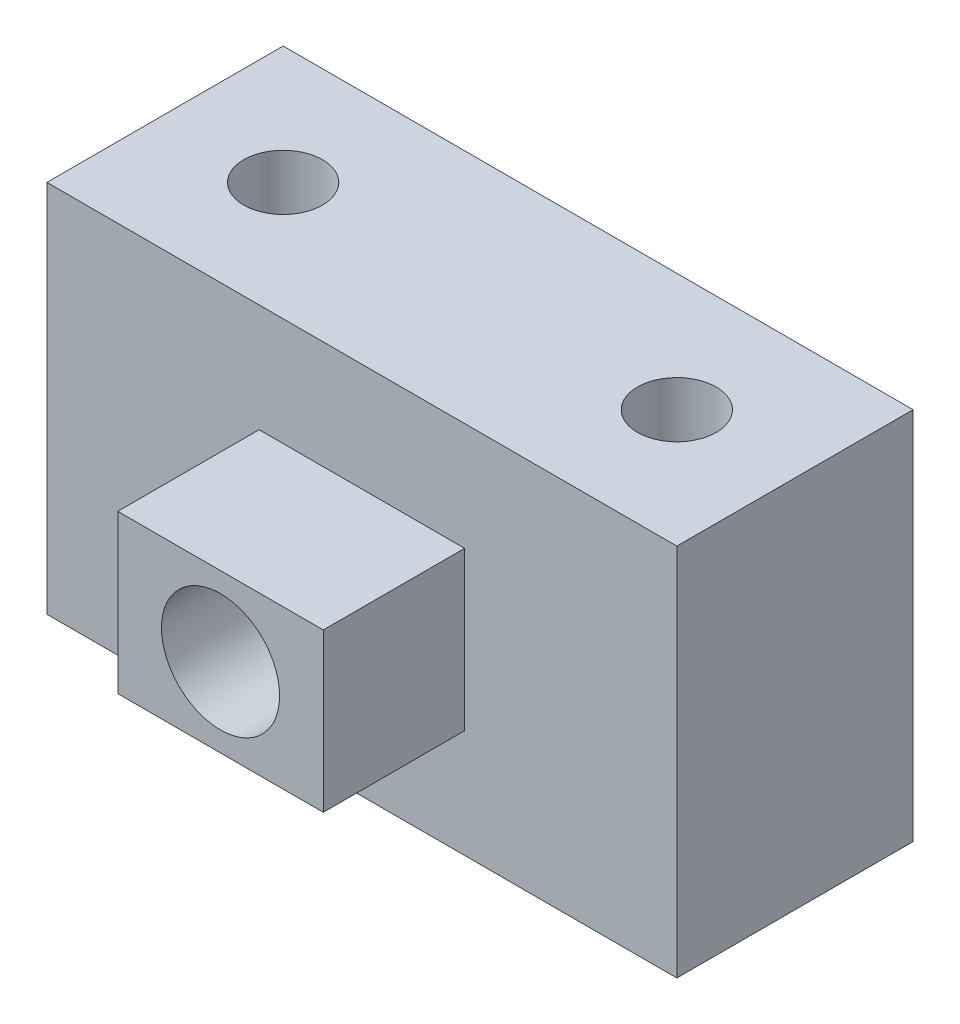
ISO-10303-21;
HEADER;
FILE_DESCRIPTION(('STEP AP214'),'2;1');
FILE_NAME('part.step','',(''),(''),'','','');
FILE_SCHEMA(('AUTOMOTIVE_DESIGN { 1 0 10303 214 1 1 1 1 }'));
ENDSEC;
DATA;
#1=APPLICATION_CONTEXT('core data for automotive mechanical design processes');
#2=APPLICATION_PROTOCOL_DEFINITION('international standard','automotive_design',2000,#1);
#3=PRODUCT_CONTEXT('',#1,'mechanical');
#4=PRODUCT('Part','Part','',(#3));
#5=PRODUCT_RELATED_PRODUCT_CATEGORY('part','',(#4));
#6=PRODUCT_DEFINITION_FORMATION('','',#4);
#7=PRODUCT_DEFINITION_CONTEXT('part definition',#1,'design');
#8=PRODUCT_DEFINITION('design','',#6,#7);
#9=PRODUCT_DEFINITION_SHAPE('','',#8);
#10=(LENGTH_UNIT() NAMED_UNIT(*) SI_UNIT(.MILLI.,.METRE.));
#11=(NAMED_UNIT(*) PLANE_ANGLE_UNIT() SI_UNIT($,.RADIAN.));
#12=(NAMED_UNIT(*) SI_UNIT($,.STERADIAN.) SOLID_ANGLE_UNIT());
#13=UNCERTAINTY_MEASURE_WITH_UNIT(LENGTH_MEASURE(1.E-05),#10,'distance_accuracy_value','');
#14=(GEOMETRIC_REPRESENTATION_CONTEXT(3) GLOBAL_UNCERTAINTY_ASSIGNED_CONTEXT((#13)) GLOBAL_UNIT_ASSIGNED_CONTEXT((#10,
#11,#12)) REPRESENTATION_CONTEXT('',''));
#15=CARTESIAN_POINT('',(0.,0.,0.));
#16=DIRECTION('',(0.,0.,1.));
#17=DIRECTION('',(1.,0.,0.));
#18=AXIS2_PLACEMENT_3D('',#15,#16,#17);
#19=CARTESIAN_POINT('',(-26.,0.,-12.));
#20=DIRECTION('',(0.,-1.,0.));
#21=DIRECTION('',(1.,0.,0.));
#22=AXIS2_PLACEMENT_3D('',#19,#20,#21);
#23=PLANE('',#22);
#24=CARTESIAN_POINT('',(0.,0.,-6.00000000000001));
#25=DIRECTION('',(0.,1.,0.));
#26=DIRECTION('',(0.,0.,1.));
#27=AXIS2_PLACEMENT_3D('',#24,#25,#26);
#28=CIRCLE('',#27,2.);
#29=CARTESIAN_POINT('',(0.,0.,-4.00000000000001));
#30=VERTEX_POINT('',#29);
#31=EDGE_CURVE('E141',#30,#30,#28,.T.);
#32=ORIENTED_EDGE('',*,*,#31,.T.);
#33=EDGE_LOOP('',(#32));
#34=FACE_BOUND('',#33,.T.);
#35=CARTESIAN_POINT('',(-20.,0.,-6.));
#36=DIRECTION('',(0.,1.,0.));
#37=DIRECTION('',(0.,0.,1.));
#38=AXIS2_PLACEMENT_3D('',#35,#36,#37);
#39=CIRCLE('',#38,2.);
#40=CARTESIAN_POINT('',(-20.,0.,-3.99999999999999));
#41=VERTEX_POINT('',#40);
#42=EDGE_CURVE('E136',#41,#41,#39,.T.);
#43=ORIENTED_EDGE('',*,*,#42,.T.);
#44=EDGE_LOOP('',(#43));
#45=FACE_BOUND('',#44,.T.);
#46=DIRECTION('',(1.,0.,0.));
#47=VECTOR('',#46,1.);
#48=CARTESIAN_POINT('',(-26.,0.,0.));
#49=LINE('',#48,#47);
#50=CARTESIAN_POINT('',(-26.,0.,0.));
#51=VERTEX_POINT('',#50);
#52=CARTESIAN_POINT('',(6.,0.,0.));
#53=VERTEX_POINT('',#52);
#54=EDGE_CURVE('E152',#51,#53,#49,.T.);
#55=ORIENTED_EDGE('',*,*,#54,.F.);
#56=DIRECTION('',(0.,0.,1.));
#57=VECTOR('',#56,1.);
#58=CARTESIAN_POINT('',(-26.,0.,-12.));
#59=LINE('',#58,#57);
#60=CARTESIAN_POINT('',(-26.,0.,-12.));
#61=VERTEX_POINT('',#60);
#62=EDGE_CURVE('E11',#61,#51,#59,.T.);
#63=ORIENTED_EDGE('',*,*,#62,.F.);
#64=DIRECTION('',(1.,0.,0.));
#65=VECTOR('',#64,1.);
#66=CARTESIAN_POINT('',(-6.,0.,-12.));
#67=LINE('',#66,#65);
#68=CARTESIAN_POINT('',(6.,0.,-12.));
#69=VERTEX_POINT('',#68);
#70=EDGE_CURVE('E59',#61,#69,#67,.T.);
#71=ORIENTED_EDGE('',*,*,#70,.T.);
#72=DIRECTION('',(0.,0.,1.));
#73=VECTOR('',#72,1.);
#74=CARTESIAN_POINT('',(6.,0.,-12.));
#75=LINE('',#74,#73);
#76=EDGE_CURVE('E37',#69,#53,#75,.T.);
#77=ORIENTED_EDGE('',*,*,#76,.T.);
#78=EDGE_LOOP('',(#55,#63,#71,#77));
#79=FACE_BOUND('',#78,.T.);
#80=ADVANCED_FACE('F33',(#34,#45,#79),#23,.T.);
#81=CARTESIAN_POINT('',(-26.,19.,-12.));
#82=DIRECTION('',(-1.,0.,0.));
#83=DIRECTION('',(0.,0.,1.));
#84=AXIS2_PLACEMENT_3D('',#81,#82,#83);
#85=PLANE('',#84);
#86=DIRECTION('',(0.,-1.,0.));
#87=VECTOR('',#86,1.);
#88=CARTESIAN_POINT('',(-26.,19.,0.));
#89=LINE('',#88,#87);
#90=CARTESIAN_POINT('',(-26.,19.,0.));
#91=VERTEX_POINT('',#90);
#92=EDGE_CURVE('E164',#91,#51,#89,.T.);
#93=ORIENTED_EDGE('',*,*,#92,.F.);
#94=DIRECTION('',(0.,0.,1.));
#95=VECTOR('',#94,1.);
#96=CARTESIAN_POINT('',(-26.,19.,-12.));
#97=LINE('',#96,#95);
#98=CARTESIAN_POINT('',(-26.,19.,-12.));
#99=VERTEX_POINT('',#98);
#100=EDGE_CURVE('E42',#99,#91,#97,.T.);
#101=ORIENTED_EDGE('',*,*,#100,.F.);
#102=DIRECTION('',(0.,-1.,0.));
#103=VECTOR('',#102,1.);
#104=CARTESIAN_POINT('',(-26.,19.,-12.));
#105=LINE('',#104,#103);
#106=EDGE_CURVE('E157',#99,#61,#105,.T.);
#107=ORIENTED_EDGE('',*,*,#106,.T.);
#108=ORIENTED_EDGE('',*,*,#62,.T.);
#109=EDGE_LOOP('',(#93,#101,#107,#108));
#110=FACE_BOUND('',#109,.T.);
#111=ADVANCED_FACE('F175',(#110),#85,.T.);
#112=CARTESIAN_POINT('',(-14.,19.,-12.));
#113=DIRECTION('',(0.,1.,0.));
#114=DIRECTION('',(0.,0.,1.));
#115=AXIS2_PLACEMENT_3D('',#112,#113,#114);
#116=PLANE('',#115);
#117=CARTESIAN_POINT('',(0.,19.,-6.00000000000001));
#118=DIRECTION('',(0.,1.,0.));
#119=DIRECTION('',(0.,0.,1.));
#120=AXIS2_PLACEMENT_3D('',#117,#118,#119);
#121=CIRCLE('',#120,2.);
#122=CARTESIAN_POINT('',(0.,19.,-4.00000000000001));
#123=VERTEX_POINT('',#122);
#124=EDGE_CURVE('E145',#123,#123,#121,.T.);
#125=ORIENTED_EDGE('',*,*,#124,.F.);
#126=EDGE_LOOP('',(#125));
#127=FACE_BOUND('',#126,.T.);
#128=CARTESIAN_POINT('',(-20.,19.,-6.));
#129=DIRECTION('',(0.,1.,0.));
#130=DIRECTION('',(0.,0.,1.));
#131=AXIS2_PLACEMENT_3D('',#128,#129,#130);
#132=CIRCLE('',#131,2.);
#133=CARTESIAN_POINT('',(-20.,19.,-3.99999999999999));
#134=VERTEX_POINT('',#133);
#135=EDGE_CURVE('E133',#134,#134,#132,.T.);
#136=ORIENTED_EDGE('',*,*,#135,.F.);
#137=EDGE_LOOP('',(#136));
#138=FACE_BOUND('',#137,.T.);
#139=DIRECTION('',(-1.,0.,0.));
#140=VECTOR('',#139,1.);
#141=CARTESIAN_POINT('',(-14.,19.,0.));
#142=LINE('',#141,#140);
#143=CARTESIAN_POINT('',(6.,19.,0.));
#144=VERTEX_POINT('',#143);
#145=EDGE_CURVE('E161',#144,#91,#142,.T.);
#146=ORIENTED_EDGE('',*,*,#145,.F.);
#147=DIRECTION('',(0.,0.,1.));
#148=VECTOR('',#147,1.);
#149=CARTESIAN_POINT('',(6.,19.,-12.));
#150=LINE('',#149,#148);
#151=CARTESIAN_POINT('',(6.,19.,-12.));
#152=VERTEX_POINT('',#151);
#153=EDGE_CURVE('E167',#152,#144,#150,.T.);
#154=ORIENTED_EDGE('',*,*,#153,.F.);
#155=DIRECTION('',(-1.,0.,0.));
#156=VECTOR('',#155,1.);
#157=CARTESIAN_POINT('',(6.,19.,-12.));
#158=LINE('',#157,#156);
#159=EDGE_CURVE('E155',#152,#99,#158,.T.);
#160=ORIENTED_EDGE('',*,*,#159,.T.);
#161=ORIENTED_EDGE('',*,*,#100,.T.);
#162=EDGE_LOOP('',(#146,#154,#160,#161));
#163=FACE_BOUND('',#162,.T.);
#164=ADVANCED_FACE('F179',(#127,#138,#163),#116,.T.);
#165=CARTESIAN_POINT('',(6.,0.,-12.));
#166=DIRECTION('',(1.,0.,0.));
#167=DIRECTION('',(0.,1.,0.));
#168=AXIS2_PLACEMENT_3D('',#165,#166,#167);
#169=PLANE('',#168);
#170=DIRECTION('',(0.,1.,0.));
#171=VECTOR('',#170,1.);
#172=CARTESIAN_POINT('',(6.,0.,0.));
#173=LINE('',#172,#171);
#174=EDGE_CURVE('E144',#53,#144,#173,.T.);
#175=ORIENTED_EDGE('',*,*,#174,.F.);
#176=ORIENTED_EDGE('',*,*,#76,.F.);
#177=DIRECTION('',(0.,1.,0.));
#178=VECTOR('',#177,1.);
#179=CARTESIAN_POINT('',(6.,0.,-12.));
#180=LINE('',#179,#178);
#181=EDGE_CURVE('E151',#69,#152,#180,.T.);
#182=ORIENTED_EDGE('',*,*,#181,.T.);
#183=ORIENTED_EDGE('',*,*,#153,.T.);
#184=EDGE_LOOP('',(#175,#176,#182,#183));
#185=FACE_BOUND('',#184,.T.);
#186=ADVANCED_FACE('F35',(#185),#169,.T.);
#187=CARTESIAN_POINT('',(0.,0.,-12.));
#188=DIRECTION('',(0.,0.,1.));
#189=DIRECTION('',(1.,0.,0.));
#190=AXIS2_PLACEMENT_3D('',#187,#188,#189);
#191=PLANE('',#190);
#192=CARTESIAN_POINT('',(-9.99999999999998,9.50000000000001,-12.));
#193=DIRECTION('',(0.,0.,1.));
#194=DIRECTION('',(1.,0.,0.));
#195=AXIS2_PLACEMENT_3D('',#192,#193,#194);
#196=CIRCLE('',#195,3.);
#197=CARTESIAN_POINT('',(-6.99999999999998,9.50000000000001,-12.));
#198=VERTEX_POINT('',#197);
#199=EDGE_CURVE('E234',#198,#198,#196,.T.);
#200=ORIENTED_EDGE('',*,*,#199,.T.);
#201=EDGE_LOOP('',(#200));
#202=FACE_BOUND('',#201,.T.);
#203=ORIENTED_EDGE('',*,*,#70,.F.);
#204=ORIENTED_EDGE('',*,*,#106,.F.);
#205=ORIENTED_EDGE('',*,*,#159,.F.);
#206=ORIENTED_EDGE('',*,*,#181,.F.);
#207=EDGE_LOOP('',(#203,#204,#205,#206));
#208=FACE_BOUND('',#207,.T.);
#209=ADVANCED_FACE('F178',(#202,#208),#191,.F.);
#210=CARTESIAN_POINT('',(0.,0.,0.));
#211=DIRECTION('',(0.,0.,1.));
#212=DIRECTION('',(1.,0.,0.));
#213=AXIS2_PLACEMENT_3D('',#210,#211,#212);
#214=PLANE('',#213);
#215=DIRECTION('',(1.,0.,0.));
#216=VECTOR('',#215,1.);
#217=CARTESIAN_POINT('',(-4.78096094282925,5.48938664621082,0.));
#218=LINE('',#217,#216);
#219=CARTESIAN_POINT('',(-15.2190390571707,5.48938664621082,0.));
#220=VERTEX_POINT('',#219);
#221=CARTESIAN_POINT('',(-4.78096094282925,5.48938664621082,0.));
#222=VERTEX_POINT('',#221);
#223=EDGE_CURVE('E242',#220,#222,#218,.T.);
#224=ORIENTED_EDGE('',*,*,#223,.F.);
#225=DIRECTION('',(0.,-1.,0.));
#226=VECTOR('',#225,1.);
#227=CARTESIAN_POINT('',(-15.2190390571707,5.48938664621082,0.));
#228=LINE('',#227,#226);
#229=CARTESIAN_POINT('',(-15.2190390571707,13.5106133537892,0.));
#230=VERTEX_POINT('',#229);
#231=EDGE_CURVE('E131',#230,#220,#228,.T.);
#232=ORIENTED_EDGE('',*,*,#231,.F.);
#233=DIRECTION('',(-1.,0.,0.));
#234=VECTOR('',#233,1.);
#235=CARTESIAN_POINT('',(-4.78096094282925,13.5106133537892,0.));
#236=LINE('',#235,#234);
#237=CARTESIAN_POINT('',(-4.78096094282925,13.5106133537892,0.));
#238=VERTEX_POINT('',#237);
#239=EDGE_CURVE('E127',#238,#230,#236,.T.);
#240=ORIENTED_EDGE('',*,*,#239,.F.);
#241=DIRECTION('',(0.,1.,0.));
#242=VECTOR('',#241,1.);
#243=CARTESIAN_POINT('',(-4.78096094282925,5.48938664621082,0.));
#244=LINE('',#243,#242);
#245=EDGE_CURVE('E244',#222,#238,#244,.T.);
#246=ORIENTED_EDGE('',*,*,#245,.F.);
#247=EDGE_LOOP('',(#224,#232,#240,#246));
#248=FACE_BOUND('',#247,.T.);
#249=ORIENTED_EDGE('',*,*,#54,.T.);
#250=ORIENTED_EDGE('',*,*,#174,.T.);
#251=ORIENTED_EDGE('',*,*,#145,.T.);
#252=ORIENTED_EDGE('',*,*,#92,.T.);
#253=EDGE_LOOP('',(#249,#250,#251,#252));
#254=FACE_BOUND('',#253,.T.);
#255=ADVANCED_FACE('F173',(#248,#254),#214,.T.);
#256=CARTESIAN_POINT('',(-20.,0.,-6.));
#257=DIRECTION('',(0.,1.,0.));
#258=DIRECTION('',(0.,0.,1.));
#259=AXIS2_PLACEMENT_3D('',#256,#257,#258);
#260=CYLINDRICAL_SURFACE('',#259,2.);
#261=ORIENTED_EDGE('',*,*,#42,.F.);
#262=EDGE_LOOP('',(#261));
#263=FACE_BOUND('',#262,.T.);
#264=ORIENTED_EDGE('',*,*,#135,.T.);
#265=EDGE_LOOP('',(#264));
#266=FACE_BOUND('',#265,.T.);
#267=ADVANCED_FACE('F198',(#263,#266),#260,.F.);
#268=CARTESIAN_POINT('',(0.,0.,-6.00000000000001));
#269=DIRECTION('',(0.,1.,0.));
#270=DIRECTION('',(0.,0.,1.));
#271=AXIS2_PLACEMENT_3D('',#268,#269,#270);
#272=CYLINDRICAL_SURFACE('',#271,2.);
#273=ORIENTED_EDGE('',*,*,#31,.F.);
#274=EDGE_LOOP('',(#273));
#275=FACE_BOUND('',#274,.T.);
#276=ORIENTED_EDGE('',*,*,#124,.T.);
#277=EDGE_LOOP('',(#276));
#278=FACE_BOUND('',#277,.T.);
#279=ADVANCED_FACE('F205',(#275,#278),#272,.F.);
#280=CARTESIAN_POINT('',(0.,0.,7.18));
#281=DIRECTION('',(0.,0.,1.));
#282=DIRECTION('',(1.,0.,0.));
#283=AXIS2_PLACEMENT_3D('',#280,#281,#282);
#284=PLANE('',#283);
#285=DIRECTION('',(0.,-1.,0.));
#286=VECTOR('',#285,1.);
#287=CARTESIAN_POINT('',(-15.2190390571707,5.48938664621082,7.18));
#288=LINE('',#287,#286);
#289=CARTESIAN_POINT('',(-15.2190390571707,13.5106133537892,7.18));
#290=VERTEX_POINT('',#289);
#291=CARTESIAN_POINT('',(-15.2190390571707,5.48938664621082,7.18));
#292=VERTEX_POINT('',#291);
#293=EDGE_CURVE('E118',#290,#292,#288,.T.);
#294=ORIENTED_EDGE('',*,*,#293,.T.);
#295=DIRECTION('',(1.,0.,0.));
#296=VECTOR('',#295,1.);
#297=CARTESIAN_POINT('',(-4.78096094282925,5.48938664621082,7.18));
#298=LINE('',#297,#296);
#299=CARTESIAN_POINT('',(-4.78096094282925,5.48938664621082,7.18));
#300=VERTEX_POINT('',#299);
#301=EDGE_CURVE('E107',#292,#300,#298,.T.);
#302=ORIENTED_EDGE('',*,*,#301,.T.);
#303=DIRECTION('',(0.,1.,0.));
#304=VECTOR('',#303,1.);
#305=CARTESIAN_POINT('',(-4.78096094282925,5.48938664621082,7.18));
#306=LINE('',#305,#304);
#307=CARTESIAN_POINT('',(-4.78096094282925,13.5106133537892,7.18));
#308=VERTEX_POINT('',#307);
#309=EDGE_CURVE('E117',#300,#308,#306,.T.);
#310=ORIENTED_EDGE('',*,*,#309,.T.);
#311=DIRECTION('',(-1.,0.,0.));
#312=VECTOR('',#311,1.);
#313=CARTESIAN_POINT('',(-4.78096094282925,13.5106133537892,7.18));
#314=LINE('',#313,#312);
#315=EDGE_CURVE('E123',#308,#290,#314,.T.);
#316=ORIENTED_EDGE('',*,*,#315,.T.);
#317=EDGE_LOOP('',(#294,#302,#310,#316));
#318=FACE_BOUND('',#317,.T.);
#319=CARTESIAN_POINT('',(-9.99999999999998,9.50000000000001,7.18));
#320=DIRECTION('',(0.,0.,1.));
#321=DIRECTION('',(1.,0.,0.));
#322=AXIS2_PLACEMENT_3D('',#319,#320,#321);
#323=CIRCLE('',#322,3.);
#324=CARTESIAN_POINT('',(-6.99999999999998,9.50000000000001,7.18));
#325=VERTEX_POINT('',#324);
#326=EDGE_CURVE('E231',#325,#325,#323,.T.);
#327=ORIENTED_EDGE('',*,*,#326,.F.);
#328=EDGE_LOOP('',(#327));
#329=FACE_BOUND('',#328,.T.);
#330=ADVANCED_FACE('F121',(#318,#329),#284,.T.);
#331=CARTESIAN_POINT('',(-15.2190390571707,5.48938664621082,7.18));
#332=DIRECTION('',(1.,0.,0.));
#333=DIRECTION('',(0.,0.,-1.));
#334=AXIS2_PLACEMENT_3D('',#331,#332,#333);
#335=PLANE('',#334);
#336=ORIENTED_EDGE('',*,*,#231,.T.);
#337=DIRECTION('',(0.,0.,-1.));
#338=VECTOR('',#337,1.);
#339=CARTESIAN_POINT('',(-15.2190390571707,5.48938664621082,7.18));
#340=LINE('',#339,#338);
#341=EDGE_CURVE('E111',#292,#220,#340,.T.);
#342=ORIENTED_EDGE('',*,*,#341,.F.);
#343=ORIENTED_EDGE('',*,*,#293,.F.);
#344=DIRECTION('',(0.,0.,-1.));
#345=VECTOR('',#344,1.);
#346=CARTESIAN_POINT('',(-15.2190390571707,13.5106133537892,7.18));
#347=LINE('',#346,#345);
#348=EDGE_CURVE('E240',#290,#230,#347,.T.);
#349=ORIENTED_EDGE('',*,*,#348,.T.);
#350=EDGE_LOOP('',(#336,#342,#343,#349));
#351=FACE_BOUND('',#350,.T.);
#352=ADVANCED_FACE('F129',(#351),#335,.F.);
#353=CARTESIAN_POINT('',(-4.78096094282925,5.48938664621082,7.18));
#354=DIRECTION('',(0.,1.,0.));
#355=DIRECTION('',(-1.,0.,0.));
#356=AXIS2_PLACEMENT_3D('',#353,#354,#355);
#357=PLANE('',#356);
#358=ORIENTED_EDGE('',*,*,#223,.T.);
#359=DIRECTION('',(0.,0.,-1.));
#360=VECTOR('',#359,1.);
#361=CARTESIAN_POINT('',(-4.78096094282925,5.48938664621082,7.18));
#362=LINE('',#361,#360);
#363=EDGE_CURVE('E114',#300,#222,#362,.T.);
#364=ORIENTED_EDGE('',*,*,#363,.F.);
#365=ORIENTED_EDGE('',*,*,#301,.F.);
#366=ORIENTED_EDGE('',*,*,#341,.T.);
#367=EDGE_LOOP('',(#358,#364,#365,#366));
#368=FACE_BOUND('',#367,.T.);
#369=ADVANCED_FACE('F109',(#368),#357,.F.);
#370=CARTESIAN_POINT('',(-4.78096094282925,5.48938664621082,7.18));
#371=DIRECTION('',(-1.,0.,0.));
#372=DIRECTION('',(0.,0.,1.));
#373=AXIS2_PLACEMENT_3D('',#370,#371,#372);
#374=PLANE('',#373);
#375=ORIENTED_EDGE('',*,*,#245,.T.);
#376=DIRECTION('',(0.,0.,-1.));
#377=VECTOR('',#376,1.);
#378=CARTESIAN_POINT('',(-4.78096094282925,13.5106133537892,7.18));
#379=LINE('',#378,#377);
#380=EDGE_CURVE('E50',#308,#238,#379,.T.);
#381=ORIENTED_EDGE('',*,*,#380,.F.);
#382=ORIENTED_EDGE('',*,*,#309,.F.);
#383=ORIENTED_EDGE('',*,*,#363,.T.);
#384=EDGE_LOOP('',(#375,#381,#382,#383));
#385=FACE_BOUND('',#384,.T.);
#386=ADVANCED_FACE('F214',(#385),#374,.F.);
#387=CARTESIAN_POINT('',(-4.78096094282925,13.5106133537892,7.18));
#388=DIRECTION('',(0.,-1.,0.));
#389=DIRECTION('',(0.,0.,-1.));
#390=AXIS2_PLACEMENT_3D('',#387,#388,#389);
#391=PLANE('',#390);
#392=ORIENTED_EDGE('',*,*,#239,.T.);
#393=ORIENTED_EDGE('',*,*,#348,.F.);
#394=ORIENTED_EDGE('',*,*,#315,.F.);
#395=ORIENTED_EDGE('',*,*,#380,.T.);
#396=EDGE_LOOP('',(#392,#393,#394,#395));
#397=FACE_BOUND('',#396,.T.);
#398=ADVANCED_FACE('F217',(#397),#391,.F.);
#399=CARTESIAN_POINT('',(-9.99999999999998,9.50000000000001,7.18));
#400=DIRECTION('',(0.,0.,-1.));
#401=DIRECTION('',(-1.,0.,0.));
#402=AXIS2_PLACEMENT_3D('',#399,#400,#401);
#403=CYLINDRICAL_SURFACE('',#402,3.);
#404=ORIENTED_EDGE('',*,*,#326,.T.);
#405=EDGE_LOOP('',(#404));
#406=FACE_BOUND('',#405,.T.);
#407=ORIENTED_EDGE('',*,*,#199,.F.);
#408=EDGE_LOOP('',(#407));
#409=FACE_BOUND('',#408,.T.);
#410=ADVANCED_FACE('F221',(#406,#409),#403,.F.);
#411=CLOSED_SHELL('',(#80,#111,#164,#186,#209,#255,#267,#279,#330,#352,#369,#386,#398,#410));
#412=MANIFOLD_SOLID_BREP('B2',#411);
#413=ADVANCED_BREP_SHAPE_REPRESENTATION('',(#18,#412),#14);
#414=SHAPE_DEFINITION_REPRESENTATION(#9,#413);
ENDSEC;
END-ISO-10303-21;
